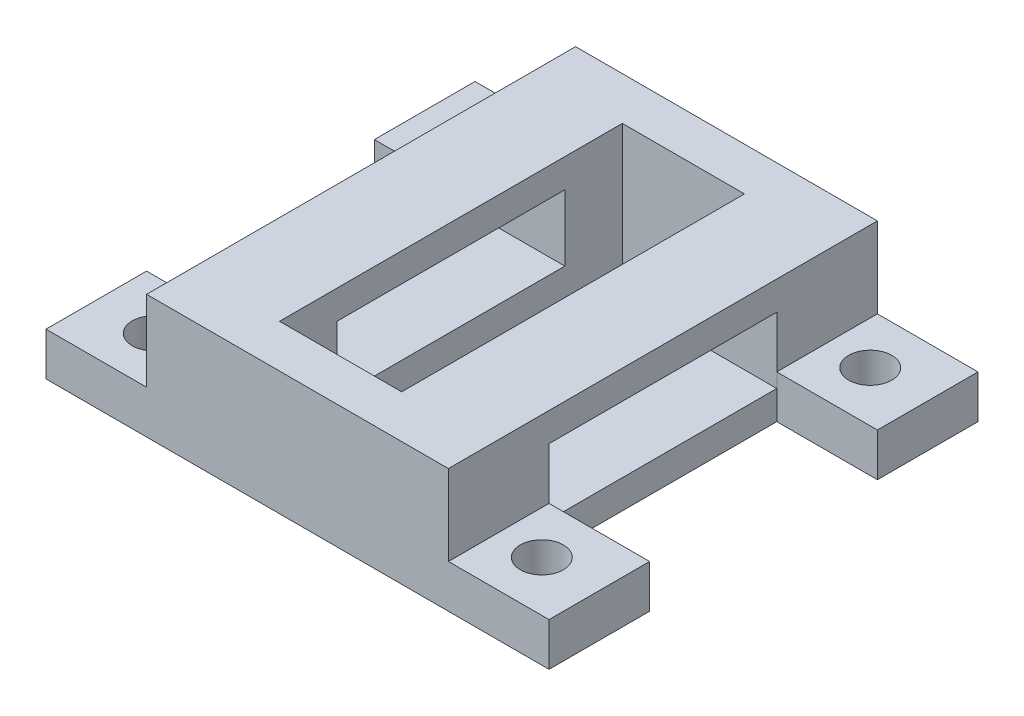
ISO-10303-21;
HEADER;
FILE_DESCRIPTION(('STEP AP214'),'2;1');
FILE_NAME('part.step','',(''),(''),'','','');
FILE_SCHEMA(('AUTOMOTIVE_DESIGN { 1 0 10303 214 1 1 1 1 }'));
ENDSEC;
DATA;
#1=APPLICATION_CONTEXT('core data for automotive mechanical design processes');
#2=APPLICATION_PROTOCOL_DEFINITION('international standard','automotive_design',2000,#1);
#3=PRODUCT_CONTEXT('',#1,'mechanical');
#4=PRODUCT('Part','Part','',(#3));
#5=PRODUCT_RELATED_PRODUCT_CATEGORY('part','',(#4));
#6=PRODUCT_DEFINITION_FORMATION('','',#4);
#7=PRODUCT_DEFINITION_CONTEXT('part definition',#1,'design');
#8=PRODUCT_DEFINITION('design','',#6,#7);
#9=PRODUCT_DEFINITION_SHAPE('','',#8);
#10=(LENGTH_UNIT() NAMED_UNIT(*) SI_UNIT(.MILLI.,.METRE.));
#11=(NAMED_UNIT(*) PLANE_ANGLE_UNIT() SI_UNIT($,.RADIAN.));
#12=(NAMED_UNIT(*) SI_UNIT($,.STERADIAN.) SOLID_ANGLE_UNIT());
#13=UNCERTAINTY_MEASURE_WITH_UNIT(LENGTH_MEASURE(1.E-05),#10,'distance_accuracy_value','');
#14=(GEOMETRIC_REPRESENTATION_CONTEXT(3) GLOBAL_UNCERTAINTY_ASSIGNED_CONTEXT((#13)) GLOBAL_UNIT_ASSIGNED_CONTEXT((#10,
#11,#12)) REPRESENTATION_CONTEXT('',''));
#15=CARTESIAN_POINT('',(0.,0.,0.));
#16=DIRECTION('',(0.,0.,1.));
#17=DIRECTION('',(1.,0.,0.));
#18=AXIS2_PLACEMENT_3D('',#15,#16,#17);
#19=CARTESIAN_POINT('',(10.5,8.6,0.));
#20=DIRECTION('',(-1.,0.,0.));
#21=DIRECTION('',(0.,0.,1.));
#22=AXIS2_PLACEMENT_3D('',#19,#20,#21);
#23=PLANE('',#22);
#24=DIRECTION('',(0.,0.,-1.));
#25=VECTOR('',#24,1.);
#26=CARTESIAN_POINT('',(10.5,0.,0.));
#27=LINE('',#26,#25);
#28=CARTESIAN_POINT('',(10.5,0.,22.8496231131986));
#29=VERTEX_POINT('',#28);
#30=CARTESIAN_POINT('',(10.5,0.,7.));
#31=VERTEX_POINT('',#30);
#32=EDGE_CURVE('E282',#29,#31,#27,.T.);
#33=ORIENTED_EDGE('',*,*,#32,.T.);
#34=DIRECTION('',(0.,-1.,0.));
#35=VECTOR('',#34,1.);
#36=CARTESIAN_POINT('',(10.5,3.,7.));
#37=LINE('',#36,#35);
#38=CARTESIAN_POINT('',(10.5,2.,7.));
#39=VERTEX_POINT('',#38);
#40=EDGE_CURVE('E493',#39,#31,#37,.T.);
#41=ORIENTED_EDGE('',*,*,#40,.F.);
#42=DIRECTION('',(0.,0.,-1.));
#43=VECTOR('',#42,1.);
#44=CARTESIAN_POINT('',(10.5,2.,22.8496231131986));
#45=LINE('',#44,#43);
#46=CARTESIAN_POINT('',(10.5,2.,22.8496231131986));
#47=VERTEX_POINT('',#46);
#48=EDGE_CURVE('E384',#47,#39,#45,.T.);
#49=ORIENTED_EDGE('',*,*,#48,.F.);
#50=DIRECTION('',(0.,-1.,0.));
#51=VECTOR('',#50,1.);
#52=CARTESIAN_POINT('',(10.5,3.,22.8496231131986));
#53=LINE('',#52,#51);
#54=EDGE_CURVE('E11',#47,#29,#53,.T.);
#55=ORIENTED_EDGE('',*,*,#54,.T.);
#56=EDGE_LOOP('',(#33,#41,#49,#55));
#57=FACE_BOUND('',#56,.T.);
#58=ADVANCED_FACE('F39',(#57),#23,.F.);
#59=CARTESIAN_POINT('',(-10.5,8.6,24.8496231131986));
#60=DIRECTION('',(1.,0.,0.));
#61=DIRECTION('',(0.,0.,-1.));
#62=AXIS2_PLACEMENT_3D('',#59,#60,#61);
#63=PLANE('',#62);
#64=DIRECTION('',(0.,0.,1.));
#65=VECTOR('',#64,1.);
#66=CARTESIAN_POINT('',(-10.5,3.,0.));
#67=LINE('',#66,#65);
#68=CARTESIAN_POINT('',(-10.5,3.,0.));
#69=VERTEX_POINT('',#68);
#70=CARTESIAN_POINT('',(-10.5,3.,7.));
#71=VERTEX_POINT('',#70);
#72=EDGE_CURVE('E521',#69,#71,#67,.T.);
#73=ORIENTED_EDGE('',*,*,#72,.T.);
#74=DIRECTION('',(0.,-1.,0.));
#75=VECTOR('',#74,1.);
#76=CARTESIAN_POINT('',(-10.5,2.,7.00000000000001));
#77=LINE('',#76,#75);
#78=CARTESIAN_POINT('',(-10.5,6.6,7.00000000000001));
#79=VERTEX_POINT('',#78);
#80=EDGE_CURVE('E399',#79,#71,#77,.T.);
#81=ORIENTED_EDGE('',*,*,#80,.F.);
#82=DIRECTION('',(0.,0.,-1.));
#83=VECTOR('',#82,1.);
#84=CARTESIAN_POINT('',(-10.5,6.6,7.00000000000001));
#85=LINE('',#84,#83);
#86=CARTESIAN_POINT('',(-10.5,6.6,22.85));
#87=VERTEX_POINT('',#86);
#88=EDGE_CURVE('E424',#87,#79,#85,.T.);
#89=ORIENTED_EDGE('',*,*,#88,.F.);
#90=DIRECTION('',(0.,1.,0.));
#91=VECTOR('',#90,1.);
#92=CARTESIAN_POINT('',(-10.5,2.,22.85));
#93=LINE('',#92,#91);
#94=CARTESIAN_POINT('',(-10.5,3.,22.85));
#95=VERTEX_POINT('',#94);
#96=EDGE_CURVE('E419',#95,#87,#93,.T.);
#97=ORIENTED_EDGE('',*,*,#96,.F.);
#98=DIRECTION('',(0.,0.,1.));
#99=VECTOR('',#98,1.);
#100=CARTESIAN_POINT('',(-10.5,3.,29.8496231131986));
#101=LINE('',#100,#99);
#102=CARTESIAN_POINT('',(-10.5,3.,29.8496231131986));
#103=VERTEX_POINT('',#102);
#104=EDGE_CURVE('E337',#95,#103,#101,.T.);
#105=ORIENTED_EDGE('',*,*,#104,.T.);
#106=DIRECTION('',(0.,-1.,0.));
#107=VECTOR('',#106,1.);
#108=CARTESIAN_POINT('',(-10.5,8.6,29.8496231131986));
#109=LINE('',#108,#107);
#110=CARTESIAN_POINT('',(-10.5,8.6,29.8496231131986));
#111=VERTEX_POINT('',#110);
#112=EDGE_CURVE('E277',#111,#103,#109,.T.);
#113=ORIENTED_EDGE('',*,*,#112,.F.);
#114=DIRECTION('',(0.,0.,1.));
#115=VECTOR('',#114,1.);
#116=CARTESIAN_POINT('',(-10.5,8.6,0.));
#117=LINE('',#116,#115);
#118=CARTESIAN_POINT('',(-10.5,8.6,0.));
#119=VERTEX_POINT('',#118);
#120=EDGE_CURVE('E474',#119,#111,#117,.T.);
#121=ORIENTED_EDGE('',*,*,#120,.F.);
#122=DIRECTION('',(0.,-1.,0.));
#123=VECTOR('',#122,1.);
#124=CARTESIAN_POINT('',(-10.5,8.6,0.));
#125=LINE('',#124,#123);
#126=EDGE_CURVE('E288',#119,#69,#125,.T.);
#127=ORIENTED_EDGE('',*,*,#126,.T.);
#128=EDGE_LOOP('',(#73,#81,#89,#97,#105,#113,#121,#127));
#129=FACE_BOUND('',#128,.T.);
#130=ADVANCED_FACE('F644',(#129),#63,.F.);
#131=DIRECTION('',(0.,0.,1.));
#132=VECTOR('',#131,1.);
#133=CARTESIAN_POINT('',(-10.5,2.,7.00000000000001));
#134=LINE('',#133,#132);
#135=CARTESIAN_POINT('',(-10.5,2.,7.00000000000001));
#136=VERTEX_POINT('',#135);
#137=CARTESIAN_POINT('',(-10.5,2.,22.8496231131986));
#138=VERTEX_POINT('',#137);
#139=EDGE_CURVE('E415',#136,#138,#134,.T.);
#140=ORIENTED_EDGE('',*,*,#139,.F.);
#141=DIRECTION('',(0.,-1.,0.));
#142=VECTOR('',#141,1.);
#143=CARTESIAN_POINT('',(-10.5,3.,7.));
#144=LINE('',#143,#142);
#145=CARTESIAN_POINT('',(-10.5,0.,7.));
#146=VERTEX_POINT('',#145);
#147=EDGE_CURVE('E538',#136,#146,#144,.T.);
#148=ORIENTED_EDGE('',*,*,#147,.T.);
#149=DIRECTION('',(0.,0.,1.));
#150=VECTOR('',#149,1.);
#151=CARTESIAN_POINT('',(-10.5,0.,24.8496231131986));
#152=LINE('',#151,#150);
#153=CARTESIAN_POINT('',(-10.5,0.,22.8496231131986));
#154=VERTEX_POINT('',#153);
#155=EDGE_CURVE('E481',#146,#154,#152,.T.);
#156=ORIENTED_EDGE('',*,*,#155,.T.);
#157=DIRECTION('',(0.,-1.,0.));
#158=VECTOR('',#157,1.);
#159=CARTESIAN_POINT('',(-10.5,3.,22.8496231131986));
#160=LINE('',#159,#158);
#161=EDGE_CURVE('E49',#138,#154,#160,.T.);
#162=ORIENTED_EDGE('',*,*,#161,.F.);
#163=EDGE_LOOP('',(#140,#148,#156,#162));
#164=FACE_BOUND('',#163,.T.);
#165=ADVANCED_FACE('F597',(#164),#63,.F.);
#166=CARTESIAN_POINT('',(10.5,8.6,0.));
#167=DIRECTION('',(0.,0.,1.));
#168=DIRECTION('',(1.,0.,0.));
#169=AXIS2_PLACEMENT_3D('',#166,#167,#168);
#170=PLANE('',#169);
#171=DIRECTION('',(-1.,0.,0.));
#172=VECTOR('',#171,1.);
#173=CARTESIAN_POINT('',(10.5,0.,0.));
#174=LINE('',#173,#172);
#175=CARTESIAN_POINT('',(17.5,0.,0.));
#176=VERTEX_POINT('',#175);
#177=CARTESIAN_POINT('',(-17.5,0.,0.));
#178=VERTEX_POINT('',#177);
#179=EDGE_CURVE('E462',#176,#178,#174,.T.);
#180=ORIENTED_EDGE('',*,*,#179,.T.);
#181=DIRECTION('',(0.,-1.,0.));
#182=VECTOR('',#181,1.);
#183=CARTESIAN_POINT('',(-17.5,3.,0.));
#184=LINE('',#183,#182);
#185=CARTESIAN_POINT('',(-17.5,3.,0.));
#186=VERTEX_POINT('',#185);
#187=EDGE_CURVE('E545',#186,#178,#184,.T.);
#188=ORIENTED_EDGE('',*,*,#187,.F.);
#189=DIRECTION('',(1.,0.,0.));
#190=VECTOR('',#189,1.);
#191=CARTESIAN_POINT('',(-10.5,3.,0.));
#192=LINE('',#191,#190);
#193=EDGE_CURVE('E534',#186,#69,#192,.T.);
#194=ORIENTED_EDGE('',*,*,#193,.T.);
#195=ORIENTED_EDGE('',*,*,#126,.F.);
#196=DIRECTION('',(-1.,0.,0.));
#197=VECTOR('',#196,1.);
#198=CARTESIAN_POINT('',(10.5,8.6,0.));
#199=LINE('',#198,#197);
#200=CARTESIAN_POINT('',(10.5,8.6,0.));
#201=VERTEX_POINT('',#200);
#202=EDGE_CURVE('E269',#201,#119,#199,.T.);
#203=ORIENTED_EDGE('',*,*,#202,.F.);
#204=DIRECTION('',(0.,-1.,0.));
#205=VECTOR('',#204,1.);
#206=CARTESIAN_POINT('',(10.5,8.6,0.));
#207=LINE('',#206,#205);
#208=CARTESIAN_POINT('',(10.5,3.,0.));
#209=VERTEX_POINT('',#208);
#210=EDGE_CURVE('E259',#201,#209,#207,.T.);
#211=ORIENTED_EDGE('',*,*,#210,.T.);
#212=DIRECTION('',(1.,0.,0.));
#213=VECTOR('',#212,1.);
#214=CARTESIAN_POINT('',(10.5,3.,0.));
#215=LINE('',#214,#213);
#216=CARTESIAN_POINT('',(17.5,3.,0.));
#217=VERTEX_POINT('',#216);
#218=EDGE_CURVE('E239',#209,#217,#215,.T.);
#219=ORIENTED_EDGE('',*,*,#218,.T.);
#220=DIRECTION('',(0.,-1.,0.));
#221=VECTOR('',#220,1.);
#222=CARTESIAN_POINT('',(17.5,3.,0.));
#223=LINE('',#222,#221);
#224=EDGE_CURVE('E517',#217,#176,#223,.T.);
#225=ORIENTED_EDGE('',*,*,#224,.T.);
#226=EDGE_LOOP('',(#180,#188,#194,#195,#203,#211,#219,#225));
#227=FACE_BOUND('',#226,.T.);
#228=ADVANCED_FACE('F41',(#227),#170,.F.);
#229=CARTESIAN_POINT('',(7.50000000000001,8.6,29.8496231131986));
#230=DIRECTION('',(0.,0.,-1.));
#231=DIRECTION('',(-1.,0.,0.));
#232=AXIS2_PLACEMENT_3D('',#229,#230,#231);
#233=PLANE('',#232);
#234=DIRECTION('',(1.,0.,0.));
#235=VECTOR('',#234,1.);
#236=CARTESIAN_POINT('',(7.50000000000001,0.,29.8496231131986));
#237=LINE('',#236,#235);
#238=CARTESIAN_POINT('',(-17.5,0.,29.8496231131986));
#239=VERTEX_POINT('',#238);
#240=CARTESIAN_POINT('',(17.5,0.,29.8496231131986));
#241=VERTEX_POINT('',#240);
#242=EDGE_CURVE('E483',#239,#241,#237,.T.);
#243=ORIENTED_EDGE('',*,*,#242,.T.);
#244=DIRECTION('',(0.,-1.,0.));
#245=VECTOR('',#244,1.);
#246=CARTESIAN_POINT('',(17.5,3.,29.8496231131986));
#247=LINE('',#246,#245);
#248=CARTESIAN_POINT('',(17.5,3.,29.8496231131986));
#249=VERTEX_POINT('',#248);
#250=EDGE_CURVE('E365',#249,#241,#247,.T.);
#251=ORIENTED_EDGE('',*,*,#250,.F.);
#252=DIRECTION('',(-1.,0.,0.));
#253=VECTOR('',#252,1.);
#254=CARTESIAN_POINT('',(10.5,3.,29.8496231131986));
#255=LINE('',#254,#253);
#256=CARTESIAN_POINT('',(10.5,3.,29.8496231131986));
#257=VERTEX_POINT('',#256);
#258=EDGE_CURVE('E568',#249,#257,#255,.T.);
#259=ORIENTED_EDGE('',*,*,#258,.T.);
#260=DIRECTION('',(0.,-1.,0.));
#261=VECTOR('',#260,1.);
#262=CARTESIAN_POINT('',(10.5,8.6,29.8496231131986));
#263=LINE('',#262,#261);
#264=CARTESIAN_POINT('',(10.5,8.6,29.8496231131986));
#265=VERTEX_POINT('',#264);
#266=EDGE_CURVE('E271',#265,#257,#263,.T.);
#267=ORIENTED_EDGE('',*,*,#266,.F.);
#268=DIRECTION('',(1.,0.,0.));
#269=VECTOR('',#268,1.);
#270=CARTESIAN_POINT('',(7.50000000000001,8.6,29.8496231131986));
#271=LINE('',#270,#269);
#272=EDGE_CURVE('E279',#111,#265,#271,.T.);
#273=ORIENTED_EDGE('',*,*,#272,.F.);
#274=ORIENTED_EDGE('',*,*,#112,.T.);
#275=DIRECTION('',(-1.,0.,0.));
#276=VECTOR('',#275,1.);
#277=CARTESIAN_POINT('',(-10.5,3.,29.8496231131986));
#278=LINE('',#277,#276);
#279=CARTESIAN_POINT('',(-17.5,3.,29.8496231131986));
#280=VERTEX_POINT('',#279);
#281=EDGE_CURVE('E64',#103,#280,#278,.T.);
#282=ORIENTED_EDGE('',*,*,#281,.T.);
#283=DIRECTION('',(0.,-1.,0.));
#284=VECTOR('',#283,1.);
#285=CARTESIAN_POINT('',(-17.5,3.,29.8496231131986));
#286=LINE('',#285,#284);
#287=EDGE_CURVE('E375',#280,#239,#286,.T.);
#288=ORIENTED_EDGE('',*,*,#287,.T.);
#289=EDGE_LOOP('',(#243,#251,#259,#267,#273,#274,#282,#288));
#290=FACE_BOUND('',#289,.T.);
#291=ADVANCED_FACE('F586',(#290),#233,.F.);
#292=DIRECTION('',(0.,1.,0.));
#293=VECTOR('',#292,1.);
#294=CARTESIAN_POINT('',(10.5,6.6,6.9996231131986));
#295=LINE('',#294,#293);
#296=CARTESIAN_POINT('',(10.5,3.,6.9996231131986));
#297=VERTEX_POINT('',#296);
#298=CARTESIAN_POINT('',(10.5,6.6,6.9996231131986));
#299=VERTEX_POINT('',#298);
#300=EDGE_CURVE('E262',#297,#299,#295,.T.);
#301=ORIENTED_EDGE('',*,*,#300,.F.);
#302=DIRECTION('',(0.,0.,-1.));
#303=VECTOR('',#302,1.);
#304=CARTESIAN_POINT('',(10.5,3.,0.));
#305=LINE('',#304,#303);
#306=EDGE_CURVE('E243',#297,#209,#305,.T.);
#307=ORIENTED_EDGE('',*,*,#306,.T.);
#308=ORIENTED_EDGE('',*,*,#210,.F.);
#309=DIRECTION('',(0.,0.,-1.));
#310=VECTOR('',#309,1.);
#311=CARTESIAN_POINT('',(10.5,8.6,24.8496231131986));
#312=LINE('',#311,#310);
#313=EDGE_CURVE('E272',#265,#201,#312,.T.);
#314=ORIENTED_EDGE('',*,*,#313,.F.);
#315=ORIENTED_EDGE('',*,*,#266,.T.);
#316=DIRECTION('',(0.,0.,-1.));
#317=VECTOR('',#316,1.);
#318=CARTESIAN_POINT('',(10.5,3.,29.8496231131986));
#319=LINE('',#318,#317);
#320=CARTESIAN_POINT('',(10.5,3.,22.8496231131986));
#321=VERTEX_POINT('',#320);
#322=EDGE_CURVE('E555',#257,#321,#319,.T.);
#323=ORIENTED_EDGE('',*,*,#322,.T.);
#324=DIRECTION('',(0.,-1.,0.));
#325=VECTOR('',#324,1.);
#326=CARTESIAN_POINT('',(10.5,6.6,22.8496231131986));
#327=LINE('',#326,#325);
#328=CARTESIAN_POINT('',(10.5,6.6,22.8496231131986));
#329=VERTEX_POINT('',#328);
#330=EDGE_CURVE('E371',#329,#321,#327,.T.);
#331=ORIENTED_EDGE('',*,*,#330,.F.);
#332=DIRECTION('',(0.,0.,1.));
#333=VECTOR('',#332,1.);
#334=CARTESIAN_POINT('',(10.5,6.6,22.8496231131986));
#335=LINE('',#334,#333);
#336=EDGE_CURVE('E391',#299,#329,#335,.T.);
#337=ORIENTED_EDGE('',*,*,#336,.F.);
#338=EDGE_LOOP('',(#301,#307,#308,#314,#315,#323,#331,#337));
#339=FACE_BOUND('',#338,.T.);
#340=ADVANCED_FACE('F257',(#339),#23,.F.);
#341=CARTESIAN_POINT('',(0.,8.6,0.));
#342=DIRECTION('',(0.,1.,0.));
#343=DIRECTION('',(0.,0.,1.));
#344=AXIS2_PLACEMENT_3D('',#341,#342,#343);
#345=PLANE('',#344);
#346=DIRECTION('',(0.,0.,-1.));
#347=VECTOR('',#346,1.);
#348=CARTESIAN_POINT('',(4.25000000000001,8.6,26.8496231131986));
#349=LINE('',#348,#347);
#350=CARTESIAN_POINT('',(4.25000000000001,8.6,26.8496231131986));
#351=VERTEX_POINT('',#350);
#352=CARTESIAN_POINT('',(4.25000000000001,8.6,2.9996231131986));
#353=VERTEX_POINT('',#352);
#354=EDGE_CURVE('E432',#351,#353,#349,.T.);
#355=ORIENTED_EDGE('',*,*,#354,.F.);
#356=DIRECTION('',(1.,0.,0.));
#357=VECTOR('',#356,1.);
#358=CARTESIAN_POINT('',(4.25000000000001,8.6,26.8496231131986));
#359=LINE('',#358,#357);
#360=CARTESIAN_POINT('',(-4.24999999999999,8.6,26.8496231131986));
#361=VERTEX_POINT('',#360);
#362=EDGE_CURVE('E454',#361,#351,#359,.T.);
#363=ORIENTED_EDGE('',*,*,#362,.F.);
#364=DIRECTION('',(0.,0.,1.));
#365=VECTOR('',#364,1.);
#366=CARTESIAN_POINT('',(-4.24999999999999,8.6,26.8496231131986));
#367=LINE('',#366,#365);
#368=CARTESIAN_POINT('',(-4.24999999999999,8.6,2.9996231131986));
#369=VERTEX_POINT('',#368);
#370=EDGE_CURVE('E450',#369,#361,#367,.T.);
#371=ORIENTED_EDGE('',*,*,#370,.F.);
#372=DIRECTION('',(-1.,0.,0.));
#373=VECTOR('',#372,1.);
#374=CARTESIAN_POINT('',(4.25000000000001,8.6,2.9996231131986));
#375=LINE('',#374,#373);
#376=EDGE_CURVE('E446',#353,#369,#375,.T.);
#377=ORIENTED_EDGE('',*,*,#376,.F.);
#378=EDGE_LOOP('',(#355,#363,#371,#377));
#379=FACE_BOUND('',#378,.T.);
#380=ORIENTED_EDGE('',*,*,#202,.T.);
#381=ORIENTED_EDGE('',*,*,#120,.T.);
#382=ORIENTED_EDGE('',*,*,#272,.T.);
#383=ORIENTED_EDGE('',*,*,#313,.T.);
#384=EDGE_LOOP('',(#380,#381,#382,#383));
#385=FACE_BOUND('',#384,.T.);
#386=ADVANCED_FACE('F643',(#379,#385),#345,.T.);
#387=CARTESIAN_POINT('',(0.,0.,0.));
#388=DIRECTION('',(0.,1.,0.));
#389=DIRECTION('',(0.,0.,1.));
#390=AXIS2_PLACEMENT_3D('',#387,#388,#389);
#391=PLANE('',#390);
#392=CARTESIAN_POINT('',(13.5,0.,3.5));
#393=DIRECTION('',(0.,1.,0.));
#394=DIRECTION('',(0.,0.,-1.));
#395=AXIS2_PLACEMENT_3D('',#392,#393,#394);
#396=CIRCLE('',#395,1.5);
#397=CARTESIAN_POINT('',(13.5,0.,2.));
#398=VERTEX_POINT('',#397);
#399=EDGE_CURVE('E765',#398,#398,#396,.T.);
#400=ORIENTED_EDGE('',*,*,#399,.T.);
#401=EDGE_LOOP('',(#400));
#402=FACE_BOUND('',#401,.T.);
#403=CARTESIAN_POINT('',(13.5,0.,26.3496231131986));
#404=DIRECTION('',(0.,1.,0.));
#405=DIRECTION('',(0.,0.,-1.));
#406=AXIS2_PLACEMENT_3D('',#403,#404,#405);
#407=CIRCLE('',#406,1.5);
#408=CARTESIAN_POINT('',(13.5,0.,24.8496231131986));
#409=VERTEX_POINT('',#408);
#410=EDGE_CURVE('E752',#409,#409,#407,.T.);
#411=ORIENTED_EDGE('',*,*,#410,.T.);
#412=EDGE_LOOP('',(#411));
#413=FACE_BOUND('',#412,.T.);
#414=CARTESIAN_POINT('',(-13.5,0.,26.3496231131986));
#415=DIRECTION('',(0.,1.,0.));
#416=DIRECTION('',(0.,0.,1.));
#417=AXIS2_PLACEMENT_3D('',#414,#415,#416);
#418=CIRCLE('',#417,1.5);
#419=CARTESIAN_POINT('',(-13.5,0.,27.8496231131986));
#420=VERTEX_POINT('',#419);
#421=EDGE_CURVE('E747',#420,#420,#418,.T.);
#422=ORIENTED_EDGE('',*,*,#421,.T.);
#423=EDGE_LOOP('',(#422));
#424=FACE_BOUND('',#423,.T.);
#425=CARTESIAN_POINT('',(-13.5,0.,3.5));
#426=DIRECTION('',(0.,1.,0.));
#427=DIRECTION('',(0.,0.,1.));
#428=AXIS2_PLACEMENT_3D('',#425,#426,#427);
#429=CIRCLE('',#428,1.5);
#430=CARTESIAN_POINT('',(-13.5,0.,5.00000000000001));
#431=VERTEX_POINT('',#430);
#432=EDGE_CURVE('E505',#431,#431,#429,.T.);
#433=ORIENTED_EDGE('',*,*,#432,.T.);
#434=EDGE_LOOP('',(#433));
#435=FACE_BOUND('',#434,.T.);
#436=DIRECTION('',(1.,0.,0.));
#437=VECTOR('',#436,1.);
#438=CARTESIAN_POINT('',(0.,0.,26.8496231131986));
#439=LINE('',#438,#437);
#440=CARTESIAN_POINT('',(-4.24999999999999,0.,26.8496231131986));
#441=VERTEX_POINT('',#440);
#442=CARTESIAN_POINT('',(4.25000000000001,0.,26.8496231131986));
#443=VERTEX_POINT('',#442);
#444=EDGE_CURVE('E300',#441,#443,#439,.T.);
#445=ORIENTED_EDGE('',*,*,#444,.T.);
#446=DIRECTION('',(0.,0.,-1.));
#447=VECTOR('',#446,1.);
#448=CARTESIAN_POINT('',(4.25000000000001,0.,0.));
#449=LINE('',#448,#447);
#450=CARTESIAN_POINT('',(4.25000000000001,0.,2.9996231131986));
#451=VERTEX_POINT('',#450);
#452=EDGE_CURVE('E304',#443,#451,#449,.T.);
#453=ORIENTED_EDGE('',*,*,#452,.T.);
#454=DIRECTION('',(-1.,0.,0.));
#455=VECTOR('',#454,1.);
#456=CARTESIAN_POINT('',(0.,0.,2.9996231131986));
#457=LINE('',#456,#455);
#458=CARTESIAN_POINT('',(-4.24999999999999,0.,2.9996231131986));
#459=VERTEX_POINT('',#458);
#460=EDGE_CURVE('E292',#451,#459,#457,.T.);
#461=ORIENTED_EDGE('',*,*,#460,.T.);
#462=DIRECTION('',(0.,0.,1.));
#463=VECTOR('',#462,1.);
#464=CARTESIAN_POINT('',(-4.24999999999999,0.,0.));
#465=LINE('',#464,#463);
#466=EDGE_CURVE('E296',#459,#441,#465,.T.);
#467=ORIENTED_EDGE('',*,*,#466,.T.);
#468=EDGE_LOOP('',(#445,#453,#461,#467));
#469=FACE_BOUND('',#468,.T.);
#470=ORIENTED_EDGE('',*,*,#179,.F.);
#471=DIRECTION('',(0.,0.,1.));
#472=VECTOR('',#471,1.);
#473=CARTESIAN_POINT('',(17.5,0.,0.));
#474=LINE('',#473,#472);
#475=CARTESIAN_POINT('',(17.5,0.,7.));
#476=VERTEX_POINT('',#475);
#477=EDGE_CURVE('E500',#176,#476,#474,.T.);
#478=ORIENTED_EDGE('',*,*,#477,.T.);
#479=DIRECTION('',(-1.,0.,0.));
#480=VECTOR('',#479,1.);
#481=CARTESIAN_POINT('',(10.5,0.,7.));
#482=LINE('',#481,#480);
#483=EDGE_CURVE('E265',#476,#31,#482,.T.);
#484=ORIENTED_EDGE('',*,*,#483,.T.);
#485=ORIENTED_EDGE('',*,*,#32,.F.);
#486=DIRECTION('',(1.,0.,0.));
#487=VECTOR('',#486,1.);
#488=CARTESIAN_POINT('',(10.5,0.,22.8496231131986));
#489=LINE('',#488,#487);
#490=CARTESIAN_POINT('',(17.5,0.,22.8496231131986));
#491=VERTEX_POINT('',#490);
#492=EDGE_CURVE('E57',#29,#491,#489,.T.);
#493=ORIENTED_EDGE('',*,*,#492,.T.);
#494=DIRECTION('',(0.,0.,1.));
#495=VECTOR('',#494,1.);
#496=CARTESIAN_POINT('',(17.5,0.,29.8496231131986));
#497=LINE('',#496,#495);
#498=EDGE_CURVE('E560',#491,#241,#497,.T.);
#499=ORIENTED_EDGE('',*,*,#498,.T.);
#500=ORIENTED_EDGE('',*,*,#242,.F.);
#501=DIRECTION('',(0.,0.,-1.));
#502=VECTOR('',#501,1.);
#503=CARTESIAN_POINT('',(-17.5,0.,29.8496231131986));
#504=LINE('',#503,#502);
#505=CARTESIAN_POINT('',(-17.5,0.,22.8496231131986));
#506=VERTEX_POINT('',#505);
#507=EDGE_CURVE('E358',#239,#506,#504,.T.);
#508=ORIENTED_EDGE('',*,*,#507,.T.);
#509=DIRECTION('',(1.,0.,0.));
#510=VECTOR('',#509,1.);
#511=CARTESIAN_POINT('',(-10.5,0.,22.8496231131986));
#512=LINE('',#511,#510);
#513=EDGE_CURVE('E351',#506,#154,#512,.T.);
#514=ORIENTED_EDGE('',*,*,#513,.T.);
#515=ORIENTED_EDGE('',*,*,#155,.F.);
#516=DIRECTION('',(-1.,0.,0.));
#517=VECTOR('',#516,1.);
#518=CARTESIAN_POINT('',(-10.5,0.,7.));
#519=LINE('',#518,#517);
#520=CARTESIAN_POINT('',(-17.5,0.,7.));
#521=VERTEX_POINT('',#520);
#522=EDGE_CURVE('E513',#146,#521,#519,.T.);
#523=ORIENTED_EDGE('',*,*,#522,.T.);
#524=DIRECTION('',(0.,0.,-1.));
#525=VECTOR('',#524,1.);
#526=CARTESIAN_POINT('',(-17.5,0.,0.));
#527=LINE('',#526,#525);
#528=EDGE_CURVE('E526',#521,#178,#527,.T.);
#529=ORIENTED_EDGE('',*,*,#528,.T.);
#530=EDGE_LOOP('',(#470,#478,#484,#485,#493,#499,#500,#508,#514,#515,#523,#529));
#531=FACE_BOUND('',#530,.T.);
#532=ADVANCED_FACE('F495',(#402,#413,#424,#435,#469,#531),#391,.F.);
#533=CARTESIAN_POINT('',(4.25000000000001,-1.4,26.8496231131986));
#534=DIRECTION('',(1.,0.,0.));
#535=DIRECTION('',(0.,0.,-1.));
#536=AXIS2_PLACEMENT_3D('',#533,#534,#535);
#537=PLANE('',#536);
#538=DIRECTION('',(0.,0.,1.));
#539=VECTOR('',#538,1.);
#540=CARTESIAN_POINT('',(4.25000000000001,6.6,26.8496231131986));
#541=LINE('',#540,#539);
#542=CARTESIAN_POINT('',(4.25000000000001,6.6,6.9996231131986));
#543=VERTEX_POINT('',#542);
#544=CARTESIAN_POINT('',(4.25000000000001,6.6,22.8496231131986));
#545=VERTEX_POINT('',#544);
#546=EDGE_CURVE('E331',#543,#545,#541,.T.);
#547=ORIENTED_EDGE('',*,*,#546,.T.);
#548=DIRECTION('',(0.,-1.,0.));
#549=VECTOR('',#548,1.);
#550=CARTESIAN_POINT('',(4.25000000000001,-1.4,22.8496231131986));
#551=LINE('',#550,#549);
#552=CARTESIAN_POINT('',(4.25000000000001,2.,22.8496231131986));
#553=VERTEX_POINT('',#552);
#554=EDGE_CURVE('E43',#545,#553,#551,.T.);
#555=ORIENTED_EDGE('',*,*,#554,.T.);
#556=DIRECTION('',(0.,0.,-1.));
#557=VECTOR('',#556,1.);
#558=CARTESIAN_POINT('',(4.25000000000001,2.,26.8496231131986));
#559=LINE('',#558,#557);
#560=CARTESIAN_POINT('',(4.25000000000001,2.,6.9996231131986));
#561=VERTEX_POINT('',#560);
#562=EDGE_CURVE('E324',#553,#561,#559,.T.);
#563=ORIENTED_EDGE('',*,*,#562,.T.);
#564=DIRECTION('',(0.,1.,0.));
#565=VECTOR('',#564,1.);
#566=CARTESIAN_POINT('',(4.25000000000001,-1.4,6.9996231131986));
#567=LINE('',#566,#565);
#568=EDGE_CURVE('E328',#561,#543,#567,.T.);
#569=ORIENTED_EDGE('',*,*,#568,.T.);
#570=EDGE_LOOP('',(#547,#555,#563,#569));
#571=FACE_BOUND('',#570,.T.);
#572=DIRECTION('',(0.,1.,0.));
#573=VECTOR('',#572,1.);
#574=CARTESIAN_POINT('',(4.25000000000001,-1.4,26.8496231131986));
#575=LINE('',#574,#573);
#576=EDGE_CURVE('E459',#443,#351,#575,.T.);
#577=ORIENTED_EDGE('',*,*,#576,.T.);
#578=ORIENTED_EDGE('',*,*,#354,.T.);
#579=DIRECTION('',(0.,1.,0.));
#580=VECTOR('',#579,1.);
#581=CARTESIAN_POINT('',(4.25000000000001,-1.4,2.9996231131986));
#582=LINE('',#581,#580);
#583=EDGE_CURVE('E458',#451,#353,#582,.T.);
#584=ORIENTED_EDGE('',*,*,#583,.F.);
#585=ORIENTED_EDGE('',*,*,#452,.F.);
#586=EDGE_LOOP('',(#577,#578,#584,#585));
#587=FACE_BOUND('',#586,.T.);
#588=ADVANCED_FACE('F630',(#571,#587),#537,.F.);
#589=CARTESIAN_POINT('',(4.25000000000001,-1.4,26.8496231131986));
#590=DIRECTION('',(0.,0.,1.));
#591=DIRECTION('',(1.,0.,0.));
#592=AXIS2_PLACEMENT_3D('',#589,#590,#591);
#593=PLANE('',#592);
#594=DIRECTION('',(0.,1.,0.));
#595=VECTOR('',#594,1.);
#596=CARTESIAN_POINT('',(-4.24999999999999,-1.4,26.8496231131986));
#597=LINE('',#596,#595);
#598=EDGE_CURVE('E463',#441,#361,#597,.T.);
#599=ORIENTED_EDGE('',*,*,#598,.T.);
#600=ORIENTED_EDGE('',*,*,#362,.T.);
#601=ORIENTED_EDGE('',*,*,#576,.F.);
#602=ORIENTED_EDGE('',*,*,#444,.F.);
#603=EDGE_LOOP('',(#599,#600,#601,#602));
#604=FACE_BOUND('',#603,.T.);
#605=ADVANCED_FACE('F664',(#604),#593,.F.);
#606=CARTESIAN_POINT('',(-4.24999999999999,-1.4,26.8496231131986));
#607=DIRECTION('',(-1.,0.,0.));
#608=DIRECTION('',(0.,0.,1.));
#609=AXIS2_PLACEMENT_3D('',#606,#607,#608);
#610=PLANE('',#609);
#611=DIRECTION('',(0.,0.,-1.));
#612=VECTOR('',#611,1.);
#613=CARTESIAN_POINT('',(-4.24999999999999,6.6,26.8496231131986));
#614=LINE('',#613,#612);
#615=CARTESIAN_POINT('',(-4.24999999999999,6.6,22.85));
#616=VERTEX_POINT('',#615);
#617=CARTESIAN_POINT('',(-4.24999999999999,6.6,7.00000000000001));
#618=VERTEX_POINT('',#617);
#619=EDGE_CURVE('E316',#616,#618,#614,.T.);
#620=ORIENTED_EDGE('',*,*,#619,.T.);
#621=DIRECTION('',(0.,-1.,0.));
#622=VECTOR('',#621,1.);
#623=CARTESIAN_POINT('',(-4.24999999999999,-1.4,7.00000000000001));
#624=LINE('',#623,#622);
#625=CARTESIAN_POINT('',(-4.24999999999999,2.,7.00000000000001));
#626=VERTEX_POINT('',#625);
#627=EDGE_CURVE('E320',#618,#626,#624,.T.);
#628=ORIENTED_EDGE('',*,*,#627,.T.);
#629=DIRECTION('',(0.,0.,1.));
#630=VECTOR('',#629,1.);
#631=CARTESIAN_POINT('',(-4.24999999999999,2.,26.8496231131986));
#632=LINE('',#631,#630);
#633=CARTESIAN_POINT('',(-4.24999999999999,2.,22.85));
#634=VERTEX_POINT('',#633);
#635=EDGE_CURVE('E308',#626,#634,#632,.T.);
#636=ORIENTED_EDGE('',*,*,#635,.T.);
#637=DIRECTION('',(0.,1.,0.));
#638=VECTOR('',#637,1.);
#639=CARTESIAN_POINT('',(-4.24999999999999,-1.4,22.85));
#640=LINE('',#639,#638);
#641=EDGE_CURVE('E312',#634,#616,#640,.T.);
#642=ORIENTED_EDGE('',*,*,#641,.T.);
#643=EDGE_LOOP('',(#620,#628,#636,#642));
#644=FACE_BOUND('',#643,.T.);
#645=DIRECTION('',(0.,1.,0.));
#646=VECTOR('',#645,1.);
#647=CARTESIAN_POINT('',(-4.24999999999999,-1.4,2.9996231131986));
#648=LINE('',#647,#646);
#649=EDGE_CURVE('E466',#459,#369,#648,.T.);
#650=ORIENTED_EDGE('',*,*,#649,.T.);
#651=ORIENTED_EDGE('',*,*,#370,.T.);
#652=ORIENTED_EDGE('',*,*,#598,.F.);
#653=ORIENTED_EDGE('',*,*,#466,.F.);
#654=EDGE_LOOP('',(#650,#651,#652,#653));
#655=FACE_BOUND('',#654,.T.);
#656=ADVANCED_FACE('F606',(#644,#655),#610,.F.);
#657=CARTESIAN_POINT('',(4.25000000000001,-1.4,2.9996231131986));
#658=DIRECTION('',(0.,0.,-1.));
#659=DIRECTION('',(-1.,0.,0.));
#660=AXIS2_PLACEMENT_3D('',#657,#658,#659);
#661=PLANE('',#660);
#662=ORIENTED_EDGE('',*,*,#583,.T.);
#663=ORIENTED_EDGE('',*,*,#376,.T.);
#664=ORIENTED_EDGE('',*,*,#649,.F.);
#665=ORIENTED_EDGE('',*,*,#460,.F.);
#666=EDGE_LOOP('',(#662,#663,#664,#665));
#667=FACE_BOUND('',#666,.T.);
#668=ADVANCED_FACE('F665',(#667),#661,.F.);
#669=CARTESIAN_POINT('',(-0.5,2.,7.));
#670=DIRECTION('',(0.,0.,-1.));
#671=DIRECTION('',(-1.,0.,0.));
#672=AXIS2_PLACEMENT_3D('',#669,#670,#671);
#673=PLANE('',#672);
#674=DIRECTION('',(-1.,0.,0.));
#675=VECTOR('',#674,1.);
#676=CARTESIAN_POINT('',(-0.5,6.6,7.));
#677=LINE('',#676,#675);
#678=EDGE_CURVE('E429',#618,#79,#677,.T.);
#679=ORIENTED_EDGE('',*,*,#678,.T.);
#680=ORIENTED_EDGE('',*,*,#80,.T.);
#681=DIRECTION('',(-1.,0.,0.));
#682=VECTOR('',#681,1.);
#683=CARTESIAN_POINT('',(-10.5,3.,7.));
#684=LINE('',#683,#682);
#685=CARTESIAN_POINT('',(-17.5,3.,7.));
#686=VERTEX_POINT('',#685);
#687=EDGE_CURVE('E525',#71,#686,#684,.T.);
#688=ORIENTED_EDGE('',*,*,#687,.T.);
#689=DIRECTION('',(0.,-1.,0.));
#690=VECTOR('',#689,1.);
#691=CARTESIAN_POINT('',(-17.5,3.,7.));
#692=LINE('',#691,#690);
#693=EDGE_CURVE('E549',#686,#521,#692,.T.);
#694=ORIENTED_EDGE('',*,*,#693,.T.);
#695=ORIENTED_EDGE('',*,*,#522,.F.);
#696=ORIENTED_EDGE('',*,*,#147,.F.);
#697=DIRECTION('',(-1.,0.,0.));
#698=VECTOR('',#697,1.);
#699=CARTESIAN_POINT('',(-0.5,2.,7.));
#700=LINE('',#699,#698);
#701=EDGE_CURVE('E428',#626,#136,#700,.T.);
#702=ORIENTED_EDGE('',*,*,#701,.F.);
#703=ORIENTED_EDGE('',*,*,#627,.F.);
#704=EDGE_LOOP('',(#679,#680,#688,#694,#695,#696,#702,#703));
#705=FACE_BOUND('',#704,.T.);
#706=ADVANCED_FACE('F603',(#705),#673,.F.);
#707=CARTESIAN_POINT('',(-0.5,6.6,7.));
#708=DIRECTION('',(0.,1.,0.));
#709=DIRECTION('',(0.,0.,1.));
#710=AXIS2_PLACEMENT_3D('',#707,#708,#709);
#711=PLANE('',#710);
#712=DIRECTION('',(-1.,0.,0.));
#713=VECTOR('',#712,1.);
#714=CARTESIAN_POINT('',(-0.499999999999999,6.6,22.85));
#715=LINE('',#714,#713);
#716=EDGE_CURVE('E433',#616,#87,#715,.T.);
#717=ORIENTED_EDGE('',*,*,#716,.T.);
#718=ORIENTED_EDGE('',*,*,#88,.T.);
#719=ORIENTED_EDGE('',*,*,#678,.F.);
#720=ORIENTED_EDGE('',*,*,#619,.F.);
#721=EDGE_LOOP('',(#717,#718,#719,#720));
#722=FACE_BOUND('',#721,.T.);
#723=ADVANCED_FACE('F611',(#722),#711,.F.);
#724=CARTESIAN_POINT('',(-0.499999999999999,2.,22.85));
#725=DIRECTION('',(0.,0.,1.));
#726=DIRECTION('',(1.,0.,0.));
#727=AXIS2_PLACEMENT_3D('',#724,#725,#726);
#728=PLANE('',#727);
#729=DIRECTION('',(-1.,0.,0.));
#730=VECTOR('',#729,1.);
#731=CARTESIAN_POINT('',(-0.499999999999999,2.,22.85));
#732=LINE('',#731,#730);
#733=CARTESIAN_POINT('',(-10.5,2.,22.85));
#734=VERTEX_POINT('',#733);
#735=EDGE_CURVE('E437',#634,#734,#732,.T.);
#736=ORIENTED_EDGE('',*,*,#735,.T.);
#737=EDGE_CURVE('E420',#734,#95,#93,.T.);
#738=ORIENTED_EDGE('',*,*,#737,.T.);
#739=ORIENTED_EDGE('',*,*,#96,.T.);
#740=ORIENTED_EDGE('',*,*,#716,.F.);
#741=ORIENTED_EDGE('',*,*,#641,.F.);
#742=EDGE_LOOP('',(#736,#738,#739,#740,#741));
#743=FACE_BOUND('',#742,.T.);
#744=ADVANCED_FACE('F614',(#743),#728,.F.);
#745=CARTESIAN_POINT('',(-0.5,2.,7.));
#746=DIRECTION('',(0.,-1.,0.));
#747=DIRECTION('',(0.,0.,-1.));
#748=AXIS2_PLACEMENT_3D('',#745,#746,#747);
#749=PLANE('',#748);
#750=ORIENTED_EDGE('',*,*,#701,.T.);
#751=ORIENTED_EDGE('',*,*,#139,.T.);
#752=EDGE_CURVE('E414',#138,#734,#134,.T.);
#753=ORIENTED_EDGE('',*,*,#752,.T.);
#754=ORIENTED_EDGE('',*,*,#735,.F.);
#755=ORIENTED_EDGE('',*,*,#635,.F.);
#756=EDGE_LOOP('',(#750,#751,#753,#754,#755));
#757=FACE_BOUND('',#756,.T.);
#758=ADVANCED_FACE('F600',(#757),#749,.F.);
#759=CARTESIAN_POINT('',(0.500000000000006,6.6,22.8496231131986));
#760=DIRECTION('',(0.,0.,1.));
#761=DIRECTION('',(1.,0.,0.));
#762=AXIS2_PLACEMENT_3D('',#759,#760,#761);
#763=PLANE('',#762);
#764=DIRECTION('',(1.,0.,0.));
#765=VECTOR('',#764,1.);
#766=CARTESIAN_POINT('',(0.500000000000006,6.6,22.8496231131986));
#767=LINE('',#766,#765);
#768=EDGE_CURVE('E396',#545,#329,#767,.T.);
#769=ORIENTED_EDGE('',*,*,#768,.T.);
#770=ORIENTED_EDGE('',*,*,#330,.T.);
#771=DIRECTION('',(1.,0.,0.));
#772=VECTOR('',#771,1.);
#773=CARTESIAN_POINT('',(10.5,3.,22.8496231131986));
#774=LINE('',#773,#772);
#775=CARTESIAN_POINT('',(17.5,3.,22.8496231131986));
#776=VERTEX_POINT('',#775);
#777=EDGE_CURVE('E559',#321,#776,#774,.T.);
#778=ORIENTED_EDGE('',*,*,#777,.T.);
#779=DIRECTION('',(0.,-1.,0.));
#780=VECTOR('',#779,1.);
#781=CARTESIAN_POINT('',(17.5,3.,22.8496231131986));
#782=LINE('',#781,#780);
#783=EDGE_CURVE('E572',#776,#491,#782,.T.);
#784=ORIENTED_EDGE('',*,*,#783,.T.);
#785=ORIENTED_EDGE('',*,*,#492,.F.);
#786=ORIENTED_EDGE('',*,*,#54,.F.);
#787=DIRECTION('',(1.,0.,0.));
#788=VECTOR('',#787,1.);
#789=CARTESIAN_POINT('',(0.500000000000006,2.,22.8496231131986));
#790=LINE('',#789,#788);
#791=EDGE_CURVE('E395',#553,#47,#790,.T.);
#792=ORIENTED_EDGE('',*,*,#791,.F.);
#793=ORIENTED_EDGE('',*,*,#554,.F.);
#794=EDGE_LOOP('',(#769,#770,#778,#784,#785,#786,#792,#793));
#795=FACE_BOUND('',#794,.T.);
#796=ADVANCED_FACE('F581',(#795),#763,.F.);
#797=CARTESIAN_POINT('',(0.500000000000006,6.6,22.8496231131986));
#798=DIRECTION('',(0.,1.,0.));
#799=DIRECTION('',(0.,0.,1.));
#800=AXIS2_PLACEMENT_3D('',#797,#798,#799);
#801=PLANE('',#800);
#802=DIRECTION('',(1.,0.,0.));
#803=VECTOR('',#802,1.);
#804=CARTESIAN_POINT('',(0.500000000000004,6.6,6.9996231131986));
#805=LINE('',#804,#803);
#806=EDGE_CURVE('E400',#543,#299,#805,.T.);
#807=ORIENTED_EDGE('',*,*,#806,.T.);
#808=ORIENTED_EDGE('',*,*,#336,.T.);
#809=ORIENTED_EDGE('',*,*,#768,.F.);
#810=ORIENTED_EDGE('',*,*,#546,.F.);
#811=EDGE_LOOP('',(#807,#808,#809,#810));
#812=FACE_BOUND('',#811,.T.);
#813=ADVANCED_FACE('F635',(#812),#801,.F.);
#814=CARTESIAN_POINT('',(0.500000000000004,6.6,6.9996231131986));
#815=DIRECTION('',(0.,0.,-1.));
#816=DIRECTION('',(-1.,0.,0.));
#817=AXIS2_PLACEMENT_3D('',#814,#815,#816);
#818=PLANE('',#817);
#819=DIRECTION('',(1.,0.,0.));
#820=VECTOR('',#819,1.);
#821=CARTESIAN_POINT('',(0.500000000000004,2.,6.9996231131986));
#822=LINE('',#821,#820);
#823=CARTESIAN_POINT('',(10.5,2.,6.9996231131986));
#824=VERTEX_POINT('',#823);
#825=EDGE_CURVE('E404',#561,#824,#822,.T.);
#826=ORIENTED_EDGE('',*,*,#825,.T.);
#827=EDGE_CURVE('E388',#824,#297,#295,.T.);
#828=ORIENTED_EDGE('',*,*,#827,.T.);
#829=ORIENTED_EDGE('',*,*,#300,.T.);
#830=ORIENTED_EDGE('',*,*,#806,.F.);
#831=ORIENTED_EDGE('',*,*,#568,.F.);
#832=EDGE_LOOP('',(#826,#828,#829,#830,#831));
#833=FACE_BOUND('',#832,.T.);
#834=ADVANCED_FACE('F628',(#833),#818,.F.);
#835=CARTESIAN_POINT('',(0.500000000000006,2.,22.8496231131986));
#836=DIRECTION('',(0.,-1.,0.));
#837=DIRECTION('',(0.,0.,-1.));
#838=AXIS2_PLACEMENT_3D('',#835,#836,#837);
#839=PLANE('',#838);
#840=ORIENTED_EDGE('',*,*,#791,.T.);
#841=ORIENTED_EDGE('',*,*,#48,.T.);
#842=EDGE_CURVE('E383',#39,#824,#45,.T.);
#843=ORIENTED_EDGE('',*,*,#842,.T.);
#844=ORIENTED_EDGE('',*,*,#825,.F.);
#845=ORIENTED_EDGE('',*,*,#562,.F.);
#846=EDGE_LOOP('',(#840,#841,#843,#844,#845));
#847=FACE_BOUND('',#846,.T.);
#848=ADVANCED_FACE('F624',(#847),#839,.F.);
#849=CARTESIAN_POINT('',(-10.5,3.,29.8496231131986));
#850=DIRECTION('',(1.,0.,0.));
#851=DIRECTION('',(0.,0.,-1.));
#852=AXIS2_PLACEMENT_3D('',#849,#850,#851);
#853=PLANE('',#852);
#854=ORIENTED_EDGE('',*,*,#752,.F.);
#855=CARTESIAN_POINT('',(-10.5,3.,22.8496231131986));
#856=VERTEX_POINT('',#855);
#857=EDGE_CURVE('E347',#856,#138,#160,.T.);
#858=ORIENTED_EDGE('',*,*,#857,.F.);
#859=EDGE_CURVE('E340',#856,#95,#101,.T.);
#860=ORIENTED_EDGE('',*,*,#859,.T.);
#861=ORIENTED_EDGE('',*,*,#737,.F.);
#862=EDGE_LOOP('',(#854,#858,#860,#861));
#863=FACE_BOUND('',#862,.T.);
#864=ADVANCED_FACE('F686',(#863),#853,.T.);
#865=CARTESIAN_POINT('',(-10.5,3.,22.8496231131986));
#866=DIRECTION('',(0.,0.,-1.));
#867=DIRECTION('',(-1.,0.,0.));
#868=AXIS2_PLACEMENT_3D('',#865,#866,#867);
#869=PLANE('',#868);
#870=ORIENTED_EDGE('',*,*,#513,.F.);
#871=DIRECTION('',(0.,-1.,0.));
#872=VECTOR('',#871,1.);
#873=CARTESIAN_POINT('',(-17.5,3.,22.8496231131986));
#874=LINE('',#873,#872);
#875=CARTESIAN_POINT('',(-17.5,3.,22.8496231131986));
#876=VERTEX_POINT('',#875);
#877=EDGE_CURVE('E372',#876,#506,#874,.T.);
#878=ORIENTED_EDGE('',*,*,#877,.F.);
#879=DIRECTION('',(1.,0.,0.));
#880=VECTOR('',#879,1.);
#881=CARTESIAN_POINT('',(-10.5,3.,22.8496231131986));
#882=LINE('',#881,#880);
#883=EDGE_CURVE('E379',#876,#856,#882,.T.);
#884=ORIENTED_EDGE('',*,*,#883,.T.);
#885=ORIENTED_EDGE('',*,*,#857,.T.);
#886=ORIENTED_EDGE('',*,*,#161,.T.);
#887=EDGE_LOOP('',(#870,#878,#884,#885,#886));
#888=FACE_BOUND('',#887,.T.);
#889=ADVANCED_FACE('F593',(#888),#869,.T.);
#890=CARTESIAN_POINT('',(-17.5,3.,29.8496231131986));
#891=DIRECTION('',(-1.,0.,0.));
#892=DIRECTION('',(0.,0.,1.));
#893=AXIS2_PLACEMENT_3D('',#890,#891,#892);
#894=PLANE('',#893);
#895=ORIENTED_EDGE('',*,*,#507,.F.);
#896=ORIENTED_EDGE('',*,*,#287,.F.);
#897=DIRECTION('',(0.,0.,-1.));
#898=VECTOR('',#897,1.);
#899=CARTESIAN_POINT('',(-17.5,3.,29.8496231131986));
#900=LINE('',#899,#898);
#901=EDGE_CURVE('E356',#280,#876,#900,.T.);
#902=ORIENTED_EDGE('',*,*,#901,.T.);
#903=ORIENTED_EDGE('',*,*,#877,.T.);
#904=EDGE_LOOP('',(#895,#896,#902,#903));
#905=FACE_BOUND('',#904,.T.);
#906=ADVANCED_FACE('F589',(#905),#894,.T.);
#907=CARTESIAN_POINT('',(0.,3.,0.));
#908=DIRECTION('',(0.,1.,0.));
#909=DIRECTION('',(0.,0.,1.));
#910=AXIS2_PLACEMENT_3D('',#907,#908,#909);
#911=PLANE('',#910);
#912=CARTESIAN_POINT('',(-13.5,3.,26.3496231131986));
#913=DIRECTION('',(0.,1.,0.));
#914=DIRECTION('',(0.,0.,1.));
#915=AXIS2_PLACEMENT_3D('',#912,#913,#914);
#916=CIRCLE('',#915,1.5);
#917=CARTESIAN_POINT('',(-13.5,3.,27.8496231131986));
#918=VERTEX_POINT('',#917);
#919=EDGE_CURVE('E750',#918,#918,#916,.T.);
#920=ORIENTED_EDGE('',*,*,#919,.F.);
#921=EDGE_LOOP('',(#920));
#922=FACE_BOUND('',#921,.T.);
#923=ORIENTED_EDGE('',*,*,#859,.F.);
#924=ORIENTED_EDGE('',*,*,#883,.F.);
#925=ORIENTED_EDGE('',*,*,#901,.F.);
#926=ORIENTED_EDGE('',*,*,#281,.F.);
#927=ORIENTED_EDGE('',*,*,#104,.F.);
#928=EDGE_LOOP('',(#923,#924,#925,#926,#927));
#929=FACE_BOUND('',#928,.T.);
#930=ADVANCED_FACE('F695',(#922,#929),#911,.T.);
#931=CARTESIAN_POINT('',(17.5,3.,29.8496231131986));
#932=DIRECTION('',(1.,0.,0.));
#933=DIRECTION('',(0.,0.,-1.));
#934=AXIS2_PLACEMENT_3D('',#931,#932,#933);
#935=PLANE('',#934);
#936=ORIENTED_EDGE('',*,*,#498,.F.);
#937=ORIENTED_EDGE('',*,*,#783,.F.);
#938=DIRECTION('',(0.,0.,1.));
#939=VECTOR('',#938,1.);
#940=CARTESIAN_POINT('',(17.5,3.,29.8496231131986));
#941=LINE('',#940,#939);
#942=EDGE_CURVE('E564',#776,#249,#941,.T.);
#943=ORIENTED_EDGE('',*,*,#942,.T.);
#944=ORIENTED_EDGE('',*,*,#250,.T.);
#945=EDGE_LOOP('',(#936,#937,#943,#944));
#946=FACE_BOUND('',#945,.T.);
#947=ADVANCED_FACE('F584',(#946),#935,.T.);
#948=CARTESIAN_POINT('',(0.,3.,0.));
#949=DIRECTION('',(0.,-1.,0.));
#950=DIRECTION('',(0.,0.,-1.));
#951=AXIS2_PLACEMENT_3D('',#948,#949,#950);
#952=PLANE('',#951);
#953=CARTESIAN_POINT('',(13.5,3.,26.3496231131986));
#954=DIRECTION('',(0.,1.,0.));
#955=DIRECTION('',(0.,0.,-1.));
#956=AXIS2_PLACEMENT_3D('',#953,#954,#955);
#957=CIRCLE('',#956,1.5);
#958=CARTESIAN_POINT('',(13.5,3.,24.8496231131986));
#959=VERTEX_POINT('',#958);
#960=EDGE_CURVE('E759',#959,#959,#957,.T.);
#961=ORIENTED_EDGE('',*,*,#960,.F.);
#962=EDGE_LOOP('',(#961));
#963=FACE_BOUND('',#962,.T.);
#964=ORIENTED_EDGE('',*,*,#322,.F.);
#965=ORIENTED_EDGE('',*,*,#258,.F.);
#966=ORIENTED_EDGE('',*,*,#942,.F.);
#967=ORIENTED_EDGE('',*,*,#777,.F.);
#968=EDGE_LOOP('',(#964,#965,#966,#967));
#969=FACE_BOUND('',#968,.T.);
#970=ADVANCED_FACE('F640',(#963,#969),#952,.F.);
#971=CARTESIAN_POINT('',(-17.5,3.,0.));
#972=DIRECTION('',(-1.,0.,0.));
#973=DIRECTION('',(0.,0.,1.));
#974=AXIS2_PLACEMENT_3D('',#971,#972,#973);
#975=PLANE('',#974);
#976=ORIENTED_EDGE('',*,*,#528,.F.);
#977=ORIENTED_EDGE('',*,*,#693,.F.);
#978=DIRECTION('',(0.,0.,-1.));
#979=VECTOR('',#978,1.);
#980=CARTESIAN_POINT('',(-17.5,3.,0.));
#981=LINE('',#980,#979);
#982=EDGE_CURVE('E530',#686,#186,#981,.T.);
#983=ORIENTED_EDGE('',*,*,#982,.T.);
#984=ORIENTED_EDGE('',*,*,#187,.T.);
#985=EDGE_LOOP('',(#976,#977,#983,#984));
#986=FACE_BOUND('',#985,.T.);
#987=ADVANCED_FACE('F705',(#986),#975,.T.);
#988=CARTESIAN_POINT('',(0.,3.,0.));
#989=DIRECTION('',(0.,-1.,0.));
#990=DIRECTION('',(0.,0.,-1.));
#991=AXIS2_PLACEMENT_3D('',#988,#989,#990);
#992=PLANE('',#991);
#993=CARTESIAN_POINT('',(-13.5,3.,3.5));
#994=DIRECTION('',(0.,1.,0.));
#995=DIRECTION('',(0.,0.,1.));
#996=AXIS2_PLACEMENT_3D('',#993,#994,#995);
#997=CIRCLE('',#996,1.5);
#998=CARTESIAN_POINT('',(-13.5,3.,5.00000000000001));
#999=VERTEX_POINT('',#998);
#1000=EDGE_CURVE('E756',#999,#999,#997,.T.);
#1001=ORIENTED_EDGE('',*,*,#1000,.F.);
#1002=EDGE_LOOP('',(#1001));
#1003=FACE_BOUND('',#1002,.T.);
#1004=ORIENTED_EDGE('',*,*,#72,.F.);
#1005=ORIENTED_EDGE('',*,*,#193,.F.);
#1006=ORIENTED_EDGE('',*,*,#982,.F.);
#1007=ORIENTED_EDGE('',*,*,#687,.F.);
#1008=EDGE_LOOP('',(#1004,#1005,#1006,#1007));
#1009=FACE_BOUND('',#1008,.T.);
#1010=ADVANCED_FACE('F709',(#1003,#1009),#992,.F.);
#1011=CARTESIAN_POINT('',(10.5,3.,0.));
#1012=DIRECTION('',(-1.,0.,0.));
#1013=DIRECTION('',(0.,0.,1.));
#1014=AXIS2_PLACEMENT_3D('',#1011,#1012,#1013);
#1015=PLANE('',#1014);
#1016=ORIENTED_EDGE('',*,*,#827,.F.);
#1017=ORIENTED_EDGE('',*,*,#842,.F.);
#1018=CARTESIAN_POINT('',(10.5,3.,7.));
#1019=VERTEX_POINT('',#1018);
#1020=EDGE_CURVE('E509',#1019,#39,#37,.T.);
#1021=ORIENTED_EDGE('',*,*,#1020,.F.);
#1022=EDGE_CURVE('E252',#1019,#297,#305,.T.);
#1023=ORIENTED_EDGE('',*,*,#1022,.T.);
#1024=EDGE_LOOP('',(#1016,#1017,#1021,#1023));
#1025=FACE_BOUND('',#1024,.T.);
#1026=ADVANCED_FACE('F713',(#1025),#1015,.T.);
#1027=CARTESIAN_POINT('',(10.5,3.,7.));
#1028=DIRECTION('',(0.,0.,1.));
#1029=DIRECTION('',(1.,0.,0.));
#1030=AXIS2_PLACEMENT_3D('',#1027,#1028,#1029);
#1031=PLANE('',#1030);
#1032=ORIENTED_EDGE('',*,*,#483,.F.);
#1033=DIRECTION('',(0.,-1.,0.));
#1034=VECTOR('',#1033,1.);
#1035=CARTESIAN_POINT('',(17.5,3.,7.));
#1036=LINE('',#1035,#1034);
#1037=CARTESIAN_POINT('',(17.5,3.,7.));
#1038=VERTEX_POINT('',#1037);
#1039=EDGE_CURVE('E514',#1038,#476,#1036,.T.);
#1040=ORIENTED_EDGE('',*,*,#1039,.F.);
#1041=DIRECTION('',(-1.,0.,0.));
#1042=VECTOR('',#1041,1.);
#1043=CARTESIAN_POINT('',(10.5,3.,7.));
#1044=LINE('',#1043,#1042);
#1045=EDGE_CURVE('E520',#1038,#1019,#1044,.T.);
#1046=ORIENTED_EDGE('',*,*,#1045,.T.);
#1047=ORIENTED_EDGE('',*,*,#1020,.T.);
#1048=ORIENTED_EDGE('',*,*,#40,.T.);
#1049=EDGE_LOOP('',(#1032,#1040,#1046,#1047,#1048));
#1050=FACE_BOUND('',#1049,.T.);
#1051=ADVANCED_FACE('F717',(#1050),#1031,.T.);
#1052=CARTESIAN_POINT('',(17.5,3.,0.));
#1053=DIRECTION('',(1.,0.,0.));
#1054=DIRECTION('',(0.,0.,-1.));
#1055=AXIS2_PLACEMENT_3D('',#1052,#1053,#1054);
#1056=PLANE('',#1055);
#1057=ORIENTED_EDGE('',*,*,#477,.F.);
#1058=ORIENTED_EDGE('',*,*,#224,.F.);
#1059=DIRECTION('',(0.,0.,1.));
#1060=VECTOR('',#1059,1.);
#1061=CARTESIAN_POINT('',(17.5,3.,0.));
#1062=LINE('',#1061,#1060);
#1063=EDGE_CURVE('E247',#217,#1038,#1062,.T.);
#1064=ORIENTED_EDGE('',*,*,#1063,.T.);
#1065=ORIENTED_EDGE('',*,*,#1039,.T.);
#1066=EDGE_LOOP('',(#1057,#1058,#1064,#1065));
#1067=FACE_BOUND('',#1066,.T.);
#1068=ADVANCED_FACE('F718',(#1067),#1056,.T.);
#1069=CARTESIAN_POINT('',(0.,3.,0.));
#1070=DIRECTION('',(0.,1.,0.));
#1071=DIRECTION('',(0.,0.,1.));
#1072=AXIS2_PLACEMENT_3D('',#1069,#1070,#1071);
#1073=PLANE('',#1072);
#1074=CARTESIAN_POINT('',(13.5,3.,3.5));
#1075=DIRECTION('',(0.,1.,0.));
#1076=DIRECTION('',(0.,0.,-1.));
#1077=AXIS2_PLACEMENT_3D('',#1074,#1075,#1076);
#1078=CIRCLE('',#1077,1.5);
#1079=CARTESIAN_POINT('',(13.5,3.,2.));
#1080=VERTEX_POINT('',#1079);
#1081=EDGE_CURVE('E769',#1080,#1080,#1078,.T.);
#1082=ORIENTED_EDGE('',*,*,#1081,.F.);
#1083=EDGE_LOOP('',(#1082));
#1084=FACE_BOUND('',#1083,.T.);
#1085=ORIENTED_EDGE('',*,*,#1022,.F.);
#1086=ORIENTED_EDGE('',*,*,#1045,.F.);
#1087=ORIENTED_EDGE('',*,*,#1063,.F.);
#1088=ORIENTED_EDGE('',*,*,#218,.F.);
#1089=ORIENTED_EDGE('',*,*,#306,.F.);
#1090=EDGE_LOOP('',(#1085,#1086,#1087,#1088,#1089));
#1091=FACE_BOUND('',#1090,.T.);
#1092=ADVANCED_FACE('F242',(#1084,#1091),#1073,.T.);
#1093=CARTESIAN_POINT('',(13.5,0.,3.5));
#1094=DIRECTION('',(0.,1.,0.));
#1095=DIRECTION('',(0.,0.,1.));
#1096=AXIS2_PLACEMENT_3D('',#1093,#1094,#1095);
#1097=CYLINDRICAL_SURFACE('',#1096,1.5);
#1098=ORIENTED_EDGE('',*,*,#399,.F.);
#1099=EDGE_LOOP('',(#1098));
#1100=FACE_BOUND('',#1099,.T.);
#1101=ORIENTED_EDGE('',*,*,#1081,.T.);
#1102=EDGE_LOOP('',(#1101));
#1103=FACE_BOUND('',#1102,.T.);
#1104=ADVANCED_FACE('F726',(#1100,#1103),#1097,.F.);
#1105=CARTESIAN_POINT('',(-13.5,0.,3.5));
#1106=DIRECTION('',(0.,1.,0.));
#1107=DIRECTION('',(0.,0.,1.));
#1108=AXIS2_PLACEMENT_3D('',#1105,#1106,#1107);
#1109=CYLINDRICAL_SURFACE('',#1108,1.5);
#1110=ORIENTED_EDGE('',*,*,#432,.F.);
#1111=EDGE_LOOP('',(#1110));
#1112=FACE_BOUND('',#1111,.T.);
#1113=ORIENTED_EDGE('',*,*,#1000,.T.);
#1114=EDGE_LOOP('',(#1113));
#1115=FACE_BOUND('',#1114,.T.);
#1116=ADVANCED_FACE('F728',(#1112,#1115),#1109,.F.);
#1117=CARTESIAN_POINT('',(13.5,0.,26.3496231131986));
#1118=DIRECTION('',(0.,1.,0.));
#1119=DIRECTION('',(0.,0.,1.));
#1120=AXIS2_PLACEMENT_3D('',#1117,#1118,#1119);
#1121=CYLINDRICAL_SURFACE('',#1120,1.5);
#1122=ORIENTED_EDGE('',*,*,#410,.F.);
#1123=EDGE_LOOP('',(#1122));
#1124=FACE_BOUND('',#1123,.T.);
#1125=ORIENTED_EDGE('',*,*,#960,.T.);
#1126=EDGE_LOOP('',(#1125));
#1127=FACE_BOUND('',#1126,.T.);
#1128=ADVANCED_FACE('F731',(#1124,#1127),#1121,.F.);
#1129=CARTESIAN_POINT('',(-13.5,0.,26.3496231131986));
#1130=DIRECTION('',(0.,1.,0.));
#1131=DIRECTION('',(0.,0.,1.));
#1132=AXIS2_PLACEMENT_3D('',#1129,#1130,#1131);
#1133=CYLINDRICAL_SURFACE('',#1132,1.5);
#1134=ORIENTED_EDGE('',*,*,#421,.F.);
#1135=EDGE_LOOP('',(#1134));
#1136=FACE_BOUND('',#1135,.T.);
#1137=ORIENTED_EDGE('',*,*,#919,.T.);
#1138=EDGE_LOOP('',(#1137));
#1139=FACE_BOUND('',#1138,.T.);
#1140=ADVANCED_FACE('F738',(#1136,#1139),#1133,.F.);
#1141=CLOSED_SHELL('',(#58,#130,#165,#228,#291,#340,#386,#532,#588,#605,#656,#668,#706,#723,
#744,#758,#796,#813,#834,#848,#864,#889,#906,#930,#947,#970,#987,#1010,#1026,#1051,#1068,#1092,
#1104,#1116,#1128,#1140));
#1142=MANIFOLD_SOLID_BREP('B2',#1141);
#1143=ADVANCED_BREP_SHAPE_REPRESENTATION('',(#18,#1142),#14);
#1144=SHAPE_DEFINITION_REPRESENTATION(#9,#1143);
ENDSEC;
END-ISO-10303-21;
